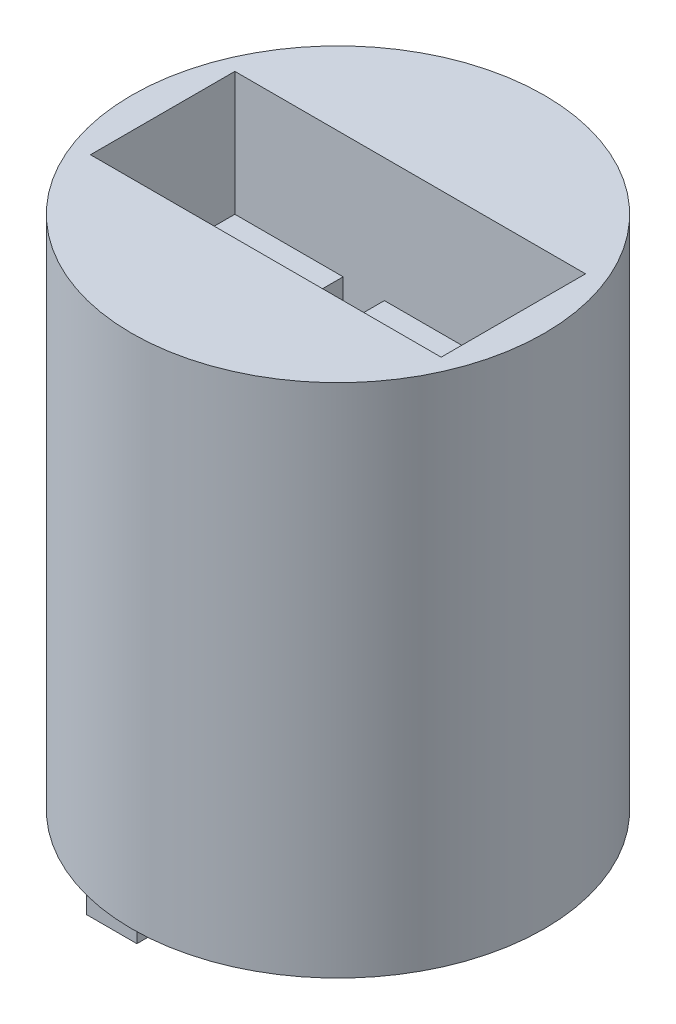
ISO-10303-21;
HEADER;
FILE_DESCRIPTION(('STEP AP214'),'2;1');
FILE_NAME('part.step','',(''),(''),'','','');
FILE_SCHEMA(('AUTOMOTIVE_DESIGN { 1 0 10303 214 1 1 1 1 }'));
ENDSEC;
DATA;
#1=APPLICATION_CONTEXT('core data for automotive mechanical design processes');
#2=APPLICATION_PROTOCOL_DEFINITION('international standard','automotive_design',2000,#1);
#3=PRODUCT_CONTEXT('',#1,'mechanical');
#4=PRODUCT('Part','Part','',(#3));
#5=PRODUCT_RELATED_PRODUCT_CATEGORY('part','',(#4));
#6=PRODUCT_DEFINITION_FORMATION('','',#4);
#7=PRODUCT_DEFINITION_CONTEXT('part definition',#1,'design');
#8=PRODUCT_DEFINITION('design','',#6,#7);
#9=PRODUCT_DEFINITION_SHAPE('','',#8);
#10=(LENGTH_UNIT() NAMED_UNIT(*) SI_UNIT(.MILLI.,.METRE.));
#11=(NAMED_UNIT(*) PLANE_ANGLE_UNIT() SI_UNIT($,.RADIAN.));
#12=(NAMED_UNIT(*) SI_UNIT($,.STERADIAN.) SOLID_ANGLE_UNIT());
#13=UNCERTAINTY_MEASURE_WITH_UNIT(LENGTH_MEASURE(1.E-05),#10,'distance_accuracy_value','');
#14=(GEOMETRIC_REPRESENTATION_CONTEXT(3) GLOBAL_UNCERTAINTY_ASSIGNED_CONTEXT((#13)) GLOBAL_UNIT_ASSIGNED_CONTEXT((#10,
#11,#12)) REPRESENTATION_CONTEXT('',''));
#15=CARTESIAN_POINT('',(0.,0.,0.));
#16=DIRECTION('',(0.,0.,1.));
#17=DIRECTION('',(1.,0.,0.));
#18=AXIS2_PLACEMENT_3D('',#15,#16,#17);
#19=CARTESIAN_POINT('',(-8.5,-8.,-2.5));
#20=DIRECTION('',(1.,0.,0.));
#21=DIRECTION('',(0.,0.,-1.));
#22=AXIS2_PLACEMENT_3D('',#19,#20,#21);
#23=PLANE('',#22);
#24=DIRECTION('',(0.,-1.,0.));
#25=VECTOR('',#24,1.);
#26=CARTESIAN_POINT('',(-8.5,-8.,1.5));
#27=LINE('',#26,#25);
#28=CARTESIAN_POINT('',(-8.5,-0.75,1.5));
#29=VERTEX_POINT('',#28);
#30=CARTESIAN_POINT('',(-8.5,-8.,1.5));
#31=VERTEX_POINT('',#30);
#32=EDGE_CURVE('E63',#29,#31,#27,.T.);
#33=ORIENTED_EDGE('',*,*,#32,.F.);
#34=DIRECTION('',(0.,0.,1.));
#35=VECTOR('',#34,1.);
#36=CARTESIAN_POINT('',(-8.5,-0.75,1.5));
#37=LINE('',#36,#35);
#38=CARTESIAN_POINT('',(-8.5,-0.75,-1.5));
#39=VERTEX_POINT('',#38);
#40=EDGE_CURVE('E176',#39,#29,#37,.T.);
#41=ORIENTED_EDGE('',*,*,#40,.F.);
#42=DIRECTION('',(0.,1.,0.));
#43=VECTOR('',#42,1.);
#44=CARTESIAN_POINT('',(-8.5,-0.75,-1.5));
#45=LINE('',#44,#43);
#46=CARTESIAN_POINT('',(-8.5,-8.,-1.5));
#47=VERTEX_POINT('',#46);
#48=EDGE_CURVE('E68',#47,#39,#45,.T.);
#49=ORIENTED_EDGE('',*,*,#48,.F.);
#50=DIRECTION('',(0.,0.,-1.));
#51=VECTOR('',#50,1.);
#52=CARTESIAN_POINT('',(-8.5,-8.,-2.5));
#53=LINE('',#52,#51);
#54=EDGE_CURVE('E134',#31,#47,#53,.T.);
#55=ORIENTED_EDGE('',*,*,#54,.F.);
#56=EDGE_LOOP('',(#33,#41,#49,#55));
#57=FACE_BOUND('',#56,.T.);
#58=ADVANCED_FACE('F49',(#57),#23,.F.);
#59=CARTESIAN_POINT('',(-8.5,-8.,-2.5));
#60=DIRECTION('',(0.,0.,1.));
#61=DIRECTION('',(1.,0.,0.));
#62=AXIS2_PLACEMENT_3D('',#59,#60,#61);
#63=PLANE('',#62);
#64=DIRECTION('',(1.,0.,0.));
#65=VECTOR('',#64,1.);
#66=CARTESIAN_POINT('',(-8.5,0.,-2.5));
#67=LINE('',#66,#65);
#68=CARTESIAN_POINT('',(-9.7,0.,-2.5));
#69=VERTEX_POINT('',#68);
#70=CARTESIAN_POINT('',(-7.25,0.,-2.5));
#71=VERTEX_POINT('',#70);
#72=EDGE_CURVE('E135',#69,#71,#67,.T.);
#73=ORIENTED_EDGE('',*,*,#72,.T.);
#74=DIRECTION('',(0.,1.,0.));
#75=VECTOR('',#74,1.);
#76=CARTESIAN_POINT('',(-7.25,-8.,-2.5));
#77=LINE('',#76,#75);
#78=CARTESIAN_POINT('',(-7.25,-8.,-2.5));
#79=VERTEX_POINT('',#78);
#80=EDGE_CURVE('E12',#79,#71,#77,.T.);
#81=ORIENTED_EDGE('',*,*,#80,.F.);
#82=DIRECTION('',(1.,0.,0.));
#83=VECTOR('',#82,1.);
#84=CARTESIAN_POINT('',(-8.5,-8.,-2.5));
#85=LINE('',#84,#83);
#86=CARTESIAN_POINT('',(-9.7,-8.,-2.5));
#87=VERTEX_POINT('',#86);
#88=EDGE_CURVE('E144',#87,#79,#85,.T.);
#89=ORIENTED_EDGE('',*,*,#88,.F.);
#90=DIRECTION('',(0.,-1.,0.));
#91=VECTOR('',#90,1.);
#92=CARTESIAN_POINT('',(-9.7,-8.,-2.5));
#93=LINE('',#92,#91);
#94=EDGE_CURVE('E129',#69,#87,#93,.T.);
#95=ORIENTED_EDGE('',*,*,#94,.F.);
#96=EDGE_LOOP('',(#73,#81,#89,#95));
#97=FACE_BOUND('',#96,.T.);
#98=ADVANCED_FACE('F189',(#97),#63,.F.);
#99=CARTESIAN_POINT('',(-7.25,-8.,-2.5));
#100=DIRECTION('',(-1.,0.,0.));
#101=DIRECTION('',(0.,0.,1.));
#102=AXIS2_PLACEMENT_3D('',#99,#100,#101);
#103=PLANE('',#102);
#104=DIRECTION('',(0.,0.,1.));
#105=VECTOR('',#104,1.);
#106=CARTESIAN_POINT('',(-7.25,0.,-2.5));
#107=LINE('',#106,#105);
#108=CARTESIAN_POINT('',(-7.25,0.,2.5));
#109=VERTEX_POINT('',#108);
#110=EDGE_CURVE('E137',#71,#109,#107,.T.);
#111=ORIENTED_EDGE('',*,*,#110,.T.);
#112=DIRECTION('',(0.,1.,0.));
#113=VECTOR('',#112,1.);
#114=CARTESIAN_POINT('',(-7.25,-8.,2.5));
#115=LINE('',#114,#113);
#116=CARTESIAN_POINT('',(-7.25,-8.,2.5));
#117=VERTEX_POINT('',#116);
#118=EDGE_CURVE('E56',#117,#109,#115,.T.);
#119=ORIENTED_EDGE('',*,*,#118,.F.);
#120=DIRECTION('',(0.,0.,1.));
#121=VECTOR('',#120,1.);
#122=CARTESIAN_POINT('',(-7.25,-8.,-2.5));
#123=LINE('',#122,#121);
#124=EDGE_CURVE('E147',#79,#117,#123,.T.);
#125=ORIENTED_EDGE('',*,*,#124,.F.);
#126=ORIENTED_EDGE('',*,*,#80,.T.);
#127=EDGE_LOOP('',(#111,#119,#125,#126));
#128=FACE_BOUND('',#127,.T.);
#129=ADVANCED_FACE('F193',(#128),#103,.F.);
#130=CARTESIAN_POINT('',(-8.5,-8.,2.5));
#131=DIRECTION('',(0.,0.,-1.));
#132=DIRECTION('',(-1.,0.,0.));
#133=AXIS2_PLACEMENT_3D('',#130,#131,#132);
#134=PLANE('',#133);
#135=DIRECTION('',(-1.,0.,0.));
#136=VECTOR('',#135,1.);
#137=CARTESIAN_POINT('',(-8.5,0.,2.5));
#138=LINE('',#137,#136);
#139=CARTESIAN_POINT('',(-9.7,0.,2.5));
#140=VERTEX_POINT('',#139);
#141=EDGE_CURVE('E145',#109,#140,#138,.T.);
#142=ORIENTED_EDGE('',*,*,#141,.T.);
#143=DIRECTION('',(0.,1.,0.));
#144=VECTOR('',#143,1.);
#145=CARTESIAN_POINT('',(-9.7,0.,2.5));
#146=LINE('',#145,#144);
#147=CARTESIAN_POINT('',(-9.7,-8.,2.5));
#148=VERTEX_POINT('',#147);
#149=EDGE_CURVE('E167',#148,#140,#146,.T.);
#150=ORIENTED_EDGE('',*,*,#149,.F.);
#151=DIRECTION('',(-1.,0.,0.));
#152=VECTOR('',#151,1.);
#153=CARTESIAN_POINT('',(-8.5,-8.,2.5));
#154=LINE('',#153,#152);
#155=EDGE_CURVE('E149',#117,#148,#154,.T.);
#156=ORIENTED_EDGE('',*,*,#155,.F.);
#157=ORIENTED_EDGE('',*,*,#118,.T.);
#158=EDGE_LOOP('',(#142,#150,#156,#157));
#159=FACE_BOUND('',#158,.T.);
#160=ADVANCED_FACE('F157',(#159),#134,.F.);
#161=CARTESIAN_POINT('',(0.,-8.,0.));
#162=DIRECTION('',(0.,1.,0.));
#163=DIRECTION('',(0.,0.,1.));
#164=AXIS2_PLACEMENT_3D('',#161,#162,#163);
#165=PLANE('',#164);
#166=ORIENTED_EDGE('',*,*,#155,.T.);
#167=DIRECTION('',(0.,0.,1.));
#168=VECTOR('',#167,1.);
#169=CARTESIAN_POINT('',(-9.7,-8.,2.5));
#170=LINE('',#169,#168);
#171=CARTESIAN_POINT('',(-9.7,-8.,1.5));
#172=VERTEX_POINT('',#171);
#173=EDGE_CURVE('E171',#172,#148,#170,.T.);
#174=ORIENTED_EDGE('',*,*,#173,.F.);
#175=DIRECTION('',(1.,0.,0.));
#176=VECTOR('',#175,1.);
#177=CARTESIAN_POINT('',(-9.7,-8.,1.5));
#178=LINE('',#177,#176);
#179=EDGE_CURVE('E169',#172,#31,#178,.T.);
#180=ORIENTED_EDGE('',*,*,#179,.T.);
#181=ORIENTED_EDGE('',*,*,#54,.T.);
#182=DIRECTION('',(1.,0.,0.));
#183=VECTOR('',#182,1.);
#184=CARTESIAN_POINT('',(-9.7,-8.,-1.5));
#185=LINE('',#184,#183);
#186=CARTESIAN_POINT('',(-9.7,-8.,-1.5));
#187=VERTEX_POINT('',#186);
#188=EDGE_CURVE('E116',#187,#47,#185,.T.);
#189=ORIENTED_EDGE('',*,*,#188,.F.);
#190=DIRECTION('',(0.,0.,1.));
#191=VECTOR('',#190,1.);
#192=CARTESIAN_POINT('',(-9.7,-8.,-1.5));
#193=LINE('',#192,#191);
#194=EDGE_CURVE('E122',#87,#187,#193,.T.);
#195=ORIENTED_EDGE('',*,*,#194,.F.);
#196=ORIENTED_EDGE('',*,*,#88,.T.);
#197=ORIENTED_EDGE('',*,*,#124,.T.);
#198=EDGE_LOOP('',(#166,#174,#180,#181,#189,#195,#196,#197));
#199=FACE_BOUND('',#198,.T.);
#200=ADVANCED_FACE('F132',(#199),#165,.F.);
#201=CARTESIAN_POINT('',(0.,0.,0.));
#202=DIRECTION('',(0.,1.,0.));
#203=DIRECTION('',(0.,0.,1.));
#204=AXIS2_PLACEMENT_3D('',#201,#202,#203);
#205=PLANE('',#204);
#206=ORIENTED_EDGE('',*,*,#72,.F.);
#207=DIRECTION('',(0.,0.,-1.));
#208=VECTOR('',#207,1.);
#209=CARTESIAN_POINT('',(-9.7,0.,-2.5));
#210=LINE('',#209,#208);
#211=EDGE_CURVE('E166',#140,#69,#210,.T.);
#212=ORIENTED_EDGE('',*,*,#211,.F.);
#213=ORIENTED_EDGE('',*,*,#141,.F.);
#214=ORIENTED_EDGE('',*,*,#110,.F.);
#215=EDGE_LOOP('',(#206,#212,#213,#214));
#216=FACE_BOUND('',#215,.T.);
#217=ADVANCED_FACE('F165',(#216),#205,.T.);
#218=CARTESIAN_POINT('',(-9.7,-0.75,-1.5));
#219=DIRECTION('',(0.,0.,-1.));
#220=DIRECTION('',(0.,1.,0.));
#221=AXIS2_PLACEMENT_3D('',#218,#219,#220);
#222=PLANE('',#221);
#223=ORIENTED_EDGE('',*,*,#48,.T.);
#224=DIRECTION('',(1.,0.,0.));
#225=VECTOR('',#224,1.);
#226=CARTESIAN_POINT('',(-9.7,-0.75,-1.5));
#227=LINE('',#226,#225);
#228=CARTESIAN_POINT('',(-9.7,-0.75,-1.5));
#229=VERTEX_POINT('',#228);
#230=EDGE_CURVE('E118',#229,#39,#227,.T.);
#231=ORIENTED_EDGE('',*,*,#230,.F.);
#232=DIRECTION('',(0.,1.,0.));
#233=VECTOR('',#232,1.);
#234=CARTESIAN_POINT('',(-9.7,-0.75,-1.5));
#235=LINE('',#234,#233);
#236=EDGE_CURVE('E112',#187,#229,#235,.T.);
#237=ORIENTED_EDGE('',*,*,#236,.F.);
#238=ORIENTED_EDGE('',*,*,#188,.T.);
#239=EDGE_LOOP('',(#223,#231,#237,#238));
#240=FACE_BOUND('',#239,.T.);
#241=ADVANCED_FACE('F114',(#240),#222,.F.);
#242=CARTESIAN_POINT('',(-9.7,-0.75,1.5));
#243=DIRECTION('',(0.,1.,0.));
#244=DIRECTION('',(0.,0.,1.));
#245=AXIS2_PLACEMENT_3D('',#242,#243,#244);
#246=PLANE('',#245);
#247=ORIENTED_EDGE('',*,*,#40,.T.);
#248=DIRECTION('',(1.,0.,0.));
#249=VECTOR('',#248,1.);
#250=CARTESIAN_POINT('',(-9.7,-0.75,1.5));
#251=LINE('',#250,#249);
#252=CARTESIAN_POINT('',(-9.7,-0.75,1.5));
#253=VERTEX_POINT('',#252);
#254=EDGE_CURVE('E139',#253,#29,#251,.T.);
#255=ORIENTED_EDGE('',*,*,#254,.F.);
#256=DIRECTION('',(0.,0.,1.));
#257=VECTOR('',#256,1.);
#258=CARTESIAN_POINT('',(-9.7,-0.75,1.5));
#259=LINE('',#258,#257);
#260=EDGE_CURVE('E121',#229,#253,#259,.T.);
#261=ORIENTED_EDGE('',*,*,#260,.F.);
#262=ORIENTED_EDGE('',*,*,#230,.T.);
#263=EDGE_LOOP('',(#247,#255,#261,#262));
#264=FACE_BOUND('',#263,.T.);
#265=ADVANCED_FACE('F187',(#264),#246,.F.);
#266=CARTESIAN_POINT('',(-9.7,-8.,1.5));
#267=DIRECTION('',(0.,0.,1.));
#268=DIRECTION('',(1.,0.,0.));
#269=AXIS2_PLACEMENT_3D('',#266,#267,#268);
#270=PLANE('',#269);
#271=ORIENTED_EDGE('',*,*,#32,.T.);
#272=ORIENTED_EDGE('',*,*,#179,.F.);
#273=DIRECTION('',(0.,-1.,0.));
#274=VECTOR('',#273,1.);
#275=CARTESIAN_POINT('',(-9.7,-8.,1.5));
#276=LINE('',#275,#274);
#277=EDGE_CURVE('E185',#253,#172,#276,.T.);
#278=ORIENTED_EDGE('',*,*,#277,.F.);
#279=ORIENTED_EDGE('',*,*,#254,.T.);
#280=EDGE_LOOP('',(#271,#272,#278,#279));
#281=FACE_BOUND('',#280,.T.);
#282=ADVANCED_FACE('F183',(#281),#270,.F.);
#283=CARTESIAN_POINT('',(-9.7,0.,0.));
#284=DIRECTION('',(1.,0.,0.));
#285=DIRECTION('',(0.,0.,-1.));
#286=AXIS2_PLACEMENT_3D('',#283,#284,#285);
#287=PLANE('',#286);
#288=ORIENTED_EDGE('',*,*,#194,.T.);
#289=ORIENTED_EDGE('',*,*,#236,.T.);
#290=ORIENTED_EDGE('',*,*,#260,.T.);
#291=ORIENTED_EDGE('',*,*,#277,.T.);
#292=ORIENTED_EDGE('',*,*,#173,.T.);
#293=ORIENTED_EDGE('',*,*,#149,.T.);
#294=ORIENTED_EDGE('',*,*,#211,.T.);
#295=ORIENTED_EDGE('',*,*,#94,.T.);
#296=EDGE_LOOP('',(#288,#289,#290,#291,#292,#293,#294,#295));
#297=FACE_BOUND('',#296,.T.);
#298=ADVANCED_FACE('F126',(#297),#287,.F.);
#299=CLOSED_SHELL('',(#58,#98,#129,#160,#200,#217,#241,#265,#282,#298));
#300=MANIFOLD_SOLID_BREP('B2',#299);
#301=CARTESIAN_POINT('',(0.,19.,0.));
#302=DIRECTION('',(0.,-1.,0.));
#303=DIRECTION('',(0.,0.,-1.));
#304=AXIS2_PLACEMENT_3D('',#301,#302,#303);
#305=PLANE('',#304);
#306=DIRECTION('',(0.,0.,-1.));
#307=VECTOR('',#306,1.);
#308=CARTESIAN_POINT('',(-1.25,19.,-3.5));
#309=LINE('',#308,#307);
#310=CARTESIAN_POINT('',(-1.25,19.,3.5));
#311=VERTEX_POINT('',#310);
#312=CARTESIAN_POINT('',(-1.25,19.,-3.5));
#313=VERTEX_POINT('',#312);
#314=EDGE_CURVE('E366',#311,#313,#309,.T.);
#315=ORIENTED_EDGE('',*,*,#314,.F.);
#316=DIRECTION('',(1.,0.,0.));
#317=VECTOR('',#316,1.);
#318=CARTESIAN_POINT('',(-8.5,19.,3.5));
#319=LINE('',#318,#317);
#320=CARTESIAN_POINT('',(8.5,19.,3.5));
#321=VERTEX_POINT('',#320);
#322=EDGE_CURVE('E409',#311,#321,#319,.T.);
#323=ORIENTED_EDGE('',*,*,#322,.T.);
#324=DIRECTION('',(0.,0.,-1.));
#325=VECTOR('',#324,1.);
#326=CARTESIAN_POINT('',(8.5,19.,3.5));
#327=LINE('',#326,#325);
#328=CARTESIAN_POINT('',(8.5,19.,-3.5));
#329=VERTEX_POINT('',#328);
#330=EDGE_CURVE('E415',#321,#329,#327,.T.);
#331=ORIENTED_EDGE('',*,*,#330,.T.);
#332=DIRECTION('',(-1.,0.,0.));
#333=VECTOR('',#332,1.);
#334=CARTESIAN_POINT('',(-8.5,19.,-3.5));
#335=LINE('',#334,#333);
#336=EDGE_CURVE('E420',#329,#313,#335,.T.);
#337=ORIENTED_EDGE('',*,*,#336,.T.);
#338=EDGE_LOOP('',(#315,#323,#331,#337));
#339=FACE_BOUND('',#338,.T.);
#340=ADVANCED_FACE('F292',(#339),#305,.F.);
#341=DIRECTION('',(0.,0.,1.));
#342=VECTOR('',#341,1.);
#343=CARTESIAN_POINT('',(-3.25,19.,-3.5));
#344=LINE('',#343,#342);
#345=CARTESIAN_POINT('',(-3.25,19.,-3.5));
#346=VERTEX_POINT('',#345);
#347=CARTESIAN_POINT('',(-3.25,19.,3.5));
#348=VERTEX_POINT('',#347);
#349=EDGE_CURVE('E386',#346,#348,#344,.T.);
#350=ORIENTED_EDGE('',*,*,#349,.F.);
#351=CARTESIAN_POINT('',(-8.5,19.,-3.5));
#352=VERTEX_POINT('',#351);
#353=EDGE_CURVE('E419',#346,#352,#335,.T.);
#354=ORIENTED_EDGE('',*,*,#353,.T.);
#355=DIRECTION('',(0.,0.,1.));
#356=VECTOR('',#355,1.);
#357=CARTESIAN_POINT('',(-8.5,19.,3.5));
#358=LINE('',#357,#356);
#359=CARTESIAN_POINT('',(-8.5,19.,3.5));
#360=VERTEX_POINT('',#359);
#361=EDGE_CURVE('E405',#352,#360,#358,.T.);
#362=ORIENTED_EDGE('',*,*,#361,.T.);
#363=EDGE_CURVE('E411',#360,#348,#319,.T.);
#364=ORIENTED_EDGE('',*,*,#363,.T.);
#365=EDGE_LOOP('',(#350,#354,#362,#364));
#366=FACE_BOUND('',#365,.T.);
#367=ADVANCED_FACE('F466',(#366),#305,.F.);
#368=CARTESIAN_POINT('',(0.,25.,0.));
#369=DIRECTION('',(0.,-1.,0.));
#370=DIRECTION('',(0.,0.,-1.));
#371=AXIS2_PLACEMENT_3D('',#368,#369,#370);
#372=CYLINDRICAL_SURFACE('',#371,10.);
#373=CARTESIAN_POINT('',(0.,25.,0.));
#374=DIRECTION('',(0.,1.,0.));
#375=DIRECTION('',(0.,0.,1.));
#376=AXIS2_PLACEMENT_3D('',#373,#374,#375);
#377=CIRCLE('',#376,10.);
#378=CARTESIAN_POINT('',(0.,25.,10.));
#379=VERTEX_POINT('',#378);
#380=EDGE_CURVE('E47',#379,#379,#377,.T.);
#381=ORIENTED_EDGE('',*,*,#380,.F.);
#382=EDGE_LOOP('',(#381));
#383=FACE_BOUND('',#382,.T.);
#384=CARTESIAN_POINT('',(0.,0.,0.));
#385=DIRECTION('',(0.,1.,0.));
#386=DIRECTION('',(0.,0.,1.));
#387=AXIS2_PLACEMENT_3D('',#384,#385,#386);
#388=CIRCLE('',#387,10.);
#389=CARTESIAN_POINT('',(0.,0.,10.));
#390=VERTEX_POINT('',#389);
#391=EDGE_CURVE('E296',#390,#390,#388,.T.);
#392=ORIENTED_EDGE('',*,*,#391,.T.);
#393=EDGE_LOOP('',(#392));
#394=FACE_BOUND('',#393,.T.);
#395=ADVANCED_FACE('F294',(#383,#394),#372,.T.);
#396=CARTESIAN_POINT('',(0.,25.,0.));
#397=DIRECTION('',(0.,1.,0.));
#398=DIRECTION('',(0.,0.,1.));
#399=AXIS2_PLACEMENT_3D('',#396,#397,#398);
#400=PLANE('',#399);
#401=DIRECTION('',(0.,0.,1.));
#402=VECTOR('',#401,1.);
#403=CARTESIAN_POINT('',(-8.5,25.,3.5));
#404=LINE('',#403,#402);
#405=CARTESIAN_POINT('',(-8.5,25.,-3.5));
#406=VERTEX_POINT('',#405);
#407=CARTESIAN_POINT('',(-8.5,25.,3.5));
#408=VERTEX_POINT('',#407);
#409=EDGE_CURVE('E316',#406,#408,#404,.T.);
#410=ORIENTED_EDGE('',*,*,#409,.F.);
#411=DIRECTION('',(-1.,0.,0.));
#412=VECTOR('',#411,1.);
#413=CARTESIAN_POINT('',(-8.5,25.,-3.5));
#414=LINE('',#413,#412);
#415=CARTESIAN_POINT('',(8.5,25.,-3.5));
#416=VERTEX_POINT('',#415);
#417=EDGE_CURVE('E410',#416,#406,#414,.T.);
#418=ORIENTED_EDGE('',*,*,#417,.F.);
#419=DIRECTION('',(0.,0.,-1.));
#420=VECTOR('',#419,1.);
#421=CARTESIAN_POINT('',(8.5,25.,3.5));
#422=LINE('',#421,#420);
#423=CARTESIAN_POINT('',(8.5,25.,3.5));
#424=VERTEX_POINT('',#423);
#425=EDGE_CURVE('E430',#424,#416,#422,.T.);
#426=ORIENTED_EDGE('',*,*,#425,.F.);
#427=DIRECTION('',(1.,0.,0.));
#428=VECTOR('',#427,1.);
#429=CARTESIAN_POINT('',(-8.5,25.,3.5));
#430=LINE('',#429,#428);
#431=EDGE_CURVE('E426',#408,#424,#430,.T.);
#432=ORIENTED_EDGE('',*,*,#431,.F.);
#433=EDGE_LOOP('',(#410,#418,#426,#432));
#434=FACE_BOUND('',#433,.T.);
#435=ORIENTED_EDGE('',*,*,#380,.T.);
#436=EDGE_LOOP('',(#435));
#437=FACE_BOUND('',#436,.T.);
#438=ADVANCED_FACE('F454',(#434,#437),#400,.T.);
#439=CARTESIAN_POINT('',(0.,0.,0.));
#440=DIRECTION('',(0.,1.,0.));
#441=DIRECTION('',(0.,0.,1.));
#442=AXIS2_PLACEMENT_3D('',#439,#440,#441);
#443=PLANE('',#442);
#444=ORIENTED_EDGE('',*,*,#391,.F.);
#445=EDGE_LOOP('',(#444));
#446=FACE_BOUND('',#445,.T.);
#447=ADVANCED_FACE('F469',(#446),#443,.F.);
#448=CARTESIAN_POINT('',(-8.5,19.,3.5));
#449=DIRECTION('',(-1.,0.,0.));
#450=DIRECTION('',(0.,0.,1.));
#451=AXIS2_PLACEMENT_3D('',#448,#449,#450);
#452=PLANE('',#451);
#453=ORIENTED_EDGE('',*,*,#409,.T.);
#454=DIRECTION('',(0.,1.,0.));
#455=VECTOR('',#454,1.);
#456=CARTESIAN_POINT('',(-8.5,19.,3.5));
#457=LINE('',#456,#455);
#458=EDGE_CURVE('E423',#360,#408,#457,.T.);
#459=ORIENTED_EDGE('',*,*,#458,.F.);
#460=ORIENTED_EDGE('',*,*,#361,.F.);
#461=DIRECTION('',(0.,1.,0.));
#462=VECTOR('',#461,1.);
#463=CARTESIAN_POINT('',(-8.5,19.,-3.5));
#464=LINE('',#463,#462);
#465=EDGE_CURVE('E436',#352,#406,#464,.T.);
#466=ORIENTED_EDGE('',*,*,#465,.T.);
#467=EDGE_LOOP('',(#453,#459,#460,#466));
#468=FACE_BOUND('',#467,.T.);
#469=ADVANCED_FACE('F467',(#468),#452,.F.);
#470=CARTESIAN_POINT('',(-8.5,19.,-3.5));
#471=DIRECTION('',(0.,0.,-1.));
#472=DIRECTION('',(-1.,0.,0.));
#473=AXIS2_PLACEMENT_3D('',#470,#471,#472);
#474=PLANE('',#473);
#475=ORIENTED_EDGE('',*,*,#417,.T.);
#476=ORIENTED_EDGE('',*,*,#465,.F.);
#477=ORIENTED_EDGE('',*,*,#353,.F.);
#478=DIRECTION('',(0.,1.,0.));
#479=VECTOR('',#478,1.);
#480=CARTESIAN_POINT('',(-3.25,15.,-3.5));
#481=LINE('',#480,#479);
#482=CARTESIAN_POINT('',(-3.25,15.,-3.5));
#483=VERTEX_POINT('',#482);
#484=EDGE_CURVE('E308',#483,#346,#481,.T.);
#485=ORIENTED_EDGE('',*,*,#484,.F.);
#486=DIRECTION('',(-1.,0.,0.));
#487=VECTOR('',#486,1.);
#488=CARTESIAN_POINT('',(-1.25,15.,-3.5));
#489=LINE('',#488,#487);
#490=CARTESIAN_POINT('',(-1.25,15.,-3.5));
#491=VERTEX_POINT('',#490);
#492=EDGE_CURVE('E374',#491,#483,#489,.T.);
#493=ORIENTED_EDGE('',*,*,#492,.F.);
#494=DIRECTION('',(0.,1.,0.));
#495=VECTOR('',#494,1.);
#496=CARTESIAN_POINT('',(-1.25,15.,-3.5));
#497=LINE('',#496,#495);
#498=EDGE_CURVE('E359',#491,#313,#497,.T.);
#499=ORIENTED_EDGE('',*,*,#498,.T.);
#500=ORIENTED_EDGE('',*,*,#336,.F.);
#501=DIRECTION('',(0.,1.,0.));
#502=VECTOR('',#501,1.);
#503=CARTESIAN_POINT('',(8.5,19.,-3.5));
#504=LINE('',#503,#502);
#505=EDGE_CURVE('E439',#329,#416,#504,.T.);
#506=ORIENTED_EDGE('',*,*,#505,.T.);
#507=EDGE_LOOP('',(#475,#476,#477,#485,#493,#499,#500,#506));
#508=FACE_BOUND('',#507,.T.);
#509=ADVANCED_FACE('F376',(#508),#474,.F.);
#510=CARTESIAN_POINT('',(8.5,19.,3.5));
#511=DIRECTION('',(1.,0.,0.));
#512=DIRECTION('',(0.,0.,-1.));
#513=AXIS2_PLACEMENT_3D('',#510,#511,#512);
#514=PLANE('',#513);
#515=ORIENTED_EDGE('',*,*,#425,.T.);
#516=ORIENTED_EDGE('',*,*,#505,.F.);
#517=ORIENTED_EDGE('',*,*,#330,.F.);
#518=DIRECTION('',(0.,1.,0.));
#519=VECTOR('',#518,1.);
#520=CARTESIAN_POINT('',(8.5,19.,3.5));
#521=LINE('',#520,#519);
#522=EDGE_CURVE('E442',#321,#424,#521,.T.);
#523=ORIENTED_EDGE('',*,*,#522,.T.);
#524=EDGE_LOOP('',(#515,#516,#517,#523));
#525=FACE_BOUND('',#524,.T.);
#526=ADVANCED_FACE('F458',(#525),#514,.F.);
#527=CARTESIAN_POINT('',(-8.5,19.,3.5));
#528=DIRECTION('',(0.,0.,1.));
#529=DIRECTION('',(1.,0.,0.));
#530=AXIS2_PLACEMENT_3D('',#527,#528,#529);
#531=PLANE('',#530);
#532=ORIENTED_EDGE('',*,*,#431,.T.);
#533=ORIENTED_EDGE('',*,*,#522,.F.);
#534=ORIENTED_EDGE('',*,*,#322,.F.);
#535=DIRECTION('',(0.,1.,0.));
#536=VECTOR('',#535,1.);
#537=CARTESIAN_POINT('',(-1.25,15.,3.5));
#538=LINE('',#537,#536);
#539=CARTESIAN_POINT('',(-1.25,15.,3.5));
#540=VERTEX_POINT('',#539);
#541=EDGE_CURVE('E397',#540,#311,#538,.T.);
#542=ORIENTED_EDGE('',*,*,#541,.F.);
#543=DIRECTION('',(1.,0.,0.));
#544=VECTOR('',#543,1.);
#545=CARTESIAN_POINT('',(-1.25,15.,3.5));
#546=LINE('',#545,#544);
#547=CARTESIAN_POINT('',(-3.25,15.,3.5));
#548=VERTEX_POINT('',#547);
#549=EDGE_CURVE('E371',#548,#540,#546,.T.);
#550=ORIENTED_EDGE('',*,*,#549,.F.);
#551=DIRECTION('',(0.,1.,0.));
#552=VECTOR('',#551,1.);
#553=CARTESIAN_POINT('',(-3.25,15.,3.5));
#554=LINE('',#553,#552);
#555=EDGE_CURVE('E400',#548,#348,#554,.T.);
#556=ORIENTED_EDGE('',*,*,#555,.T.);
#557=ORIENTED_EDGE('',*,*,#363,.F.);
#558=ORIENTED_EDGE('',*,*,#458,.T.);
#559=EDGE_LOOP('',(#532,#533,#534,#542,#550,#556,#557,#558));
#560=FACE_BOUND('',#559,.T.);
#561=ADVANCED_FACE('F449',(#560),#531,.F.);
#562=CARTESIAN_POINT('',(-1.25,15.,-3.5));
#563=DIRECTION('',(1.,0.,0.));
#564=DIRECTION('',(0.,0.,-1.));
#565=AXIS2_PLACEMENT_3D('',#562,#563,#564);
#566=PLANE('',#565);
#567=ORIENTED_EDGE('',*,*,#314,.T.);
#568=ORIENTED_EDGE('',*,*,#498,.F.);
#569=DIRECTION('',(0.,0.,-1.));
#570=VECTOR('',#569,1.);
#571=CARTESIAN_POINT('',(-1.25,15.,-3.5));
#572=LINE('',#571,#570);
#573=EDGE_CURVE('E363',#540,#491,#572,.T.);
#574=ORIENTED_EDGE('',*,*,#573,.F.);
#575=ORIENTED_EDGE('',*,*,#541,.T.);
#576=EDGE_LOOP('',(#567,#568,#574,#575));
#577=FACE_BOUND('',#576,.T.);
#578=ADVANCED_FACE('F361',(#577),#566,.F.);
#579=CARTESIAN_POINT('',(-3.25,15.,-3.5));
#580=DIRECTION('',(-1.,0.,0.));
#581=DIRECTION('',(0.,0.,1.));
#582=AXIS2_PLACEMENT_3D('',#579,#580,#581);
#583=PLANE('',#582);
#584=ORIENTED_EDGE('',*,*,#349,.T.);
#585=ORIENTED_EDGE('',*,*,#555,.F.);
#586=DIRECTION('',(0.,0.,1.));
#587=VECTOR('',#586,1.);
#588=CARTESIAN_POINT('',(-3.25,15.,-3.5));
#589=LINE('',#588,#587);
#590=EDGE_CURVE('E381',#483,#548,#589,.T.);
#591=ORIENTED_EDGE('',*,*,#590,.F.);
#592=ORIENTED_EDGE('',*,*,#484,.T.);
#593=EDGE_LOOP('',(#584,#585,#591,#592));
#594=FACE_BOUND('',#593,.T.);
#595=ADVANCED_FACE('F492',(#594),#583,.F.);
#596=CARTESIAN_POINT('',(0.,15.,0.));
#597=DIRECTION('',(0.,-1.,0.));
#598=DIRECTION('',(0.,0.,-1.));
#599=AXIS2_PLACEMENT_3D('',#596,#597,#598);
#600=PLANE('',#599);
#601=ORIENTED_EDGE('',*,*,#573,.T.);
#602=ORIENTED_EDGE('',*,*,#492,.T.);
#603=ORIENTED_EDGE('',*,*,#590,.T.);
#604=ORIENTED_EDGE('',*,*,#549,.T.);
#605=EDGE_LOOP('',(#601,#602,#603,#604));
#606=FACE_BOUND('',#605,.T.);
#607=ADVANCED_FACE('F383',(#606),#600,.F.);
#608=CLOSED_SHELL('',(#340,#367,#395,#438,#447,#469,#509,#526,#561,#578,#595,#607));
#609=MANIFOLD_SOLID_BREP('B6',#608);
#610=ADVANCED_BREP_SHAPE_REPRESENTATION('',(#18,#300,#609),#14);
#611=SHAPE_DEFINITION_REPRESENTATION(#9,#610);
ENDSEC;
END-ISO-10303-21;
